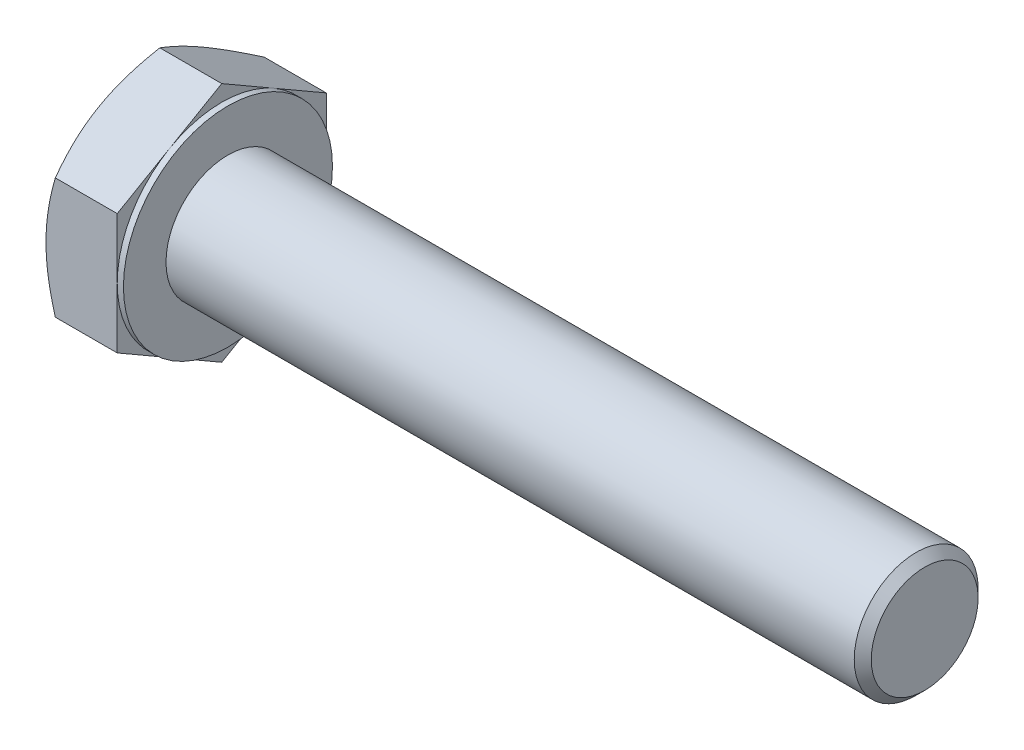
ISO-10303-21;
HEADER;
FILE_DESCRIPTION(('STEP AP214'),'2;1');
FILE_NAME('part.step','',(''),(''),'','','');
FILE_SCHEMA(('AUTOMOTIVE_DESIGN { 1 0 10303 214 1 1 1 1 }'));
ENDSEC;
DATA;
#1=APPLICATION_CONTEXT('core data for automotive mechanical design processes');
#2=APPLICATION_PROTOCOL_DEFINITION('international standard','automotive_design',2000,#1);
#3=PRODUCT_CONTEXT('',#1,'mechanical');
#4=PRODUCT('Part','Part','',(#3));
#5=PRODUCT_RELATED_PRODUCT_CATEGORY('part','',(#4));
#6=PRODUCT_DEFINITION_FORMATION('','',#4);
#7=PRODUCT_DEFINITION_CONTEXT('part definition',#1,'design');
#8=PRODUCT_DEFINITION('design','',#6,#7);
#9=PRODUCT_DEFINITION_SHAPE('','',#8);
#10=(LENGTH_UNIT() NAMED_UNIT(*) SI_UNIT(.MILLI.,.METRE.));
#11=(NAMED_UNIT(*) PLANE_ANGLE_UNIT() SI_UNIT($,.RADIAN.));
#12=(NAMED_UNIT(*) SI_UNIT($,.STERADIAN.) SOLID_ANGLE_UNIT());
#13=UNCERTAINTY_MEASURE_WITH_UNIT(LENGTH_MEASURE(1.E-05),#10,'distance_accuracy_value','');
#14=(GEOMETRIC_REPRESENTATION_CONTEXT(3) GLOBAL_UNCERTAINTY_ASSIGNED_CONTEXT((#13)) GLOBAL_UNIT_ASSIGNED_CONTEXT((#10,
#11,#12)) REPRESENTATION_CONTEXT('',''));
#15=CARTESIAN_POINT('',(0.,0.,0.));
#16=DIRECTION('',(0.,0.,1.));
#17=DIRECTION('',(1.,0.,0.));
#18=AXIS2_PLACEMENT_3D('',#15,#16,#17);
#19=CARTESIAN_POINT('',(10.,15.5884572681199,0.));
#20=DIRECTION('',(1.,0.,0.));
#21=DIRECTION('',(0.,0.,-1.));
#22=AXIS2_PLACEMENT_3D('',#19,#20,#21);
#23=PLANE('',#22);
#24=CARTESIAN_POINT('',(10.,0.,0.));
#25=DIRECTION('',(1.,0.,0.));
#26=DIRECTION('',(0.,0.,-1.));
#27=AXIS2_PLACEMENT_3D('',#24,#25,#26);
#28=CIRCLE('',#27,8.);
#29=CARTESIAN_POINT('',(10.,0.,-8.));
#30=VERTEX_POINT('',#29);
#31=EDGE_CURVE('E272',#30,#30,#28,.F.);
#32=ORIENTED_EDGE('',*,*,#31,.T.);
#33=EDGE_LOOP('',(#32));
#34=FACE_BOUND('',#33,.T.);
#35=CARTESIAN_POINT('',(10.,0.,0.));
#36=DIRECTION('',(1.,0.,0.));
#37=DIRECTION('',(0.,0.,-1.));
#38=AXIS2_PLACEMENT_3D('',#35,#36,#37);
#39=CIRCLE('',#38,13.5);
#40=CARTESIAN_POINT('',(10.,0.,-13.5));
#41=VERTEX_POINT('',#40);
#42=EDGE_CURVE('E291',#41,#41,#39,.T.);
#43=ORIENTED_EDGE('',*,*,#42,.T.);
#44=EDGE_LOOP('',(#43));
#45=FACE_BOUND('',#44,.T.);
#46=ADVANCED_FACE('F34',(#34,#45),#23,.T.);
#47=CARTESIAN_POINT('',(0.,0.,0.));
#48=DIRECTION('',(-1.,0.,0.));
#49=DIRECTION('',(0.,0.,1.));
#50=AXIS2_PLACEMENT_3D('',#47,#48,#49);
#51=CYLINDRICAL_SURFACE('',#50,8.);
#52=ORIENTED_EDGE('',*,*,#31,.F.);
#53=EDGE_LOOP('',(#52));
#54=FACE_BOUND('',#53,.T.);
#55=CARTESIAN_POINT('',(98.8985,0.,0.));
#56=DIRECTION('',(-1.,0.,0.));
#57=DIRECTION('',(0.,0.,1.));
#58=AXIS2_PLACEMENT_3D('',#55,#56,#57);
#59=CIRCLE('',#58,8.);
#60=CARTESIAN_POINT('',(98.8985,0.,8.));
#61=VERTEX_POINT('',#60);
#62=EDGE_CURVE('E269',#61,#61,#59,.T.);
#63=ORIENTED_EDGE('',*,*,#62,.T.);
#64=EDGE_LOOP('',(#63));
#65=FACE_BOUND('',#64,.T.);
#66=ADVANCED_FACE('F243',(#54,#65),#51,.T.);
#67=CARTESIAN_POINT('',(100.,0.,0.));
#68=DIRECTION('',(-1.,0.,0.));
#69=DIRECTION('',(0.,0.,1.));
#70=AXIS2_PLACEMENT_3D('',#67,#68,#69);
#71=CONICAL_SURFACE('',#70,6.8985,0.78539816339744);
#72=ORIENTED_EDGE('',*,*,#62,.F.);
#73=EDGE_LOOP('',(#72));
#74=FACE_BOUND('',#73,.T.);
#75=CARTESIAN_POINT('',(100.,0.,0.));
#76=DIRECTION('',(-1.,0.,0.));
#77=DIRECTION('',(0.,0.,1.));
#78=AXIS2_PLACEMENT_3D('',#75,#76,#77);
#79=CIRCLE('',#78,6.8985);
#80=CARTESIAN_POINT('',(100.,0.,6.8985));
#81=VERTEX_POINT('',#80);
#82=EDGE_CURVE('E267',#81,#81,#79,.T.);
#83=ORIENTED_EDGE('',*,*,#82,.T.);
#84=EDGE_LOOP('',(#83));
#85=FACE_BOUND('',#84,.T.);
#86=ADVANCED_FACE('F248',(#74,#85),#71,.T.);
#87=CARTESIAN_POINT('',(100.,0.,0.));
#88=DIRECTION('',(-1.,0.,0.));
#89=DIRECTION('',(0.,0.,1.));
#90=AXIS2_PLACEMENT_3D('',#87,#88,#89);
#91=PLANE('',#90);
#92=ORIENTED_EDGE('',*,*,#82,.F.);
#93=EDGE_LOOP('',(#92));
#94=FACE_BOUND('',#93,.T.);
#95=ADVANCED_FACE('F255',(#94),#91,.F.);
#96=CARTESIAN_POINT('',(9.2,13.5,0.));
#97=DIRECTION('',(1.,0.,0.));
#98=DIRECTION('',(0.,0.,-1.));
#99=AXIS2_PLACEMENT_3D('',#96,#97,#98);
#100=PLANE('',#99);
#101=DIRECTION('',(0.,0.500000000000001,0.866025403784438));
#102=VECTOR('',#101,1.);
#103=CARTESIAN_POINT('',(9.2,7.79422863405993,-13.5));
#104=LINE('',#103,#102);
#105=CARTESIAN_POINT('',(9.2,7.79422863405993,-13.5));
#106=VERTEX_POINT('',#105);
#107=CARTESIAN_POINT('',(9.2,11.6913429510899,-6.75000000000002));
#108=VERTEX_POINT('',#107);
#109=EDGE_CURVE('E167',#106,#108,#104,.T.);
#110=ORIENTED_EDGE('',*,*,#109,.T.);
#111=CARTESIAN_POINT('',(9.2,0.,0.));
#112=DIRECTION('',(-1.,0.,0.));
#113=DIRECTION('',(0.,0.,1.));
#114=AXIS2_PLACEMENT_3D('',#111,#112,#113);
#115=CIRCLE('',#114,13.5);
#116=CARTESIAN_POINT('',(9.2,0.,-13.5));
#117=VERTEX_POINT('',#116);
#118=EDGE_CURVE('E50',#108,#117,#115,.T.);
#119=ORIENTED_EDGE('',*,*,#118,.T.);
#120=DIRECTION('',(0.,1.,0.));
#121=VECTOR('',#120,1.);
#122=CARTESIAN_POINT('',(9.2,7.79422863405993,-13.5));
#123=LINE('',#122,#121);
#124=EDGE_CURVE('E39',#117,#106,#123,.T.);
#125=ORIENTED_EDGE('',*,*,#124,.T.);
#126=EDGE_LOOP('',(#110,#119,#125));
#127=FACE_BOUND('',#126,.T.);
#128=ADVANCED_FACE('F258',(#127),#100,.T.);
#129=CARTESIAN_POINT('',(9.2,15.5884572681199,0.));
#130=VERTEX_POINT('',#129);
#131=EDGE_CURVE('E165',#108,#130,#104,.T.);
#132=ORIENTED_EDGE('',*,*,#131,.T.);
#133=DIRECTION('',(0.,-0.500000000000001,0.866025403784438));
#134=VECTOR('',#133,1.);
#135=CARTESIAN_POINT('',(9.2,15.5884572681199,0.));
#136=LINE('',#135,#134);
#137=CARTESIAN_POINT('',(9.2,11.6913429510899,6.75000000000001));
#138=VERTEX_POINT('',#137);
#139=EDGE_CURVE('E164',#130,#138,#136,.T.);
#140=ORIENTED_EDGE('',*,*,#139,.T.);
#141=EDGE_CURVE('E153',#138,#108,#115,.T.);
#142=ORIENTED_EDGE('',*,*,#141,.T.);
#143=EDGE_LOOP('',(#132,#140,#142));
#144=FACE_BOUND('',#143,.T.);
#145=ADVANCED_FACE('F263',(#144),#100,.T.);
#146=CARTESIAN_POINT('',(9.2,7.79422863405994,13.5));
#147=VERTEX_POINT('',#146);
#148=EDGE_CURVE('E132',#138,#147,#136,.T.);
#149=ORIENTED_EDGE('',*,*,#148,.T.);
#150=DIRECTION('',(0.,-1.,0.));
#151=VECTOR('',#150,1.);
#152=CARTESIAN_POINT('',(9.2,7.79422863405994,13.5));
#153=LINE('',#152,#151);
#154=CARTESIAN_POINT('',(9.2,0.,13.5));
#155=VERTEX_POINT('',#154);
#156=EDGE_CURVE('E126',#147,#155,#153,.T.);
#157=ORIENTED_EDGE('',*,*,#156,.T.);
#158=EDGE_CURVE('E130',#155,#138,#115,.T.);
#159=ORIENTED_EDGE('',*,*,#158,.T.);
#160=EDGE_LOOP('',(#149,#157,#159));
#161=FACE_BOUND('',#160,.T.);
#162=ADVANCED_FACE('F128',(#161),#100,.T.);
#163=CARTESIAN_POINT('',(9.2,-7.79422863405994,13.5));
#164=VERTEX_POINT('',#163);
#165=EDGE_CURVE('E136',#155,#164,#153,.T.);
#166=ORIENTED_EDGE('',*,*,#165,.T.);
#167=DIRECTION('',(0.,-0.500000000000002,-0.866025403784438));
#168=VECTOR('',#167,1.);
#169=CARTESIAN_POINT('',(9.2,-15.5884572681199,0.));
#170=LINE('',#169,#168);
#171=CARTESIAN_POINT('',(9.2,-11.6913429510899,6.75000000000003));
#172=VERTEX_POINT('',#171);
#173=EDGE_CURVE('E143',#164,#172,#170,.T.);
#174=ORIENTED_EDGE('',*,*,#173,.T.);
#175=EDGE_CURVE('E140',#172,#155,#115,.T.);
#176=ORIENTED_EDGE('',*,*,#175,.T.);
#177=EDGE_LOOP('',(#166,#174,#176));
#178=FACE_BOUND('',#177,.T.);
#179=ADVANCED_FACE('F141',(#178),#100,.T.);
#180=CARTESIAN_POINT('',(9.2,-15.5884572681199,0.));
#181=VERTEX_POINT('',#180);
#182=EDGE_CURVE('E159',#172,#181,#170,.T.);
#183=ORIENTED_EDGE('',*,*,#182,.T.);
#184=DIRECTION('',(0.,0.500000000000001,-0.866025403784438));
#185=VECTOR('',#184,1.);
#186=CARTESIAN_POINT('',(9.2,-7.79422863405997,-13.5));
#187=LINE('',#186,#185);
#188=CARTESIAN_POINT('',(9.2,-11.6913429510899,-6.75000000000001));
#189=VERTEX_POINT('',#188);
#190=EDGE_CURVE('E327',#181,#189,#187,.T.);
#191=ORIENTED_EDGE('',*,*,#190,.T.);
#192=EDGE_CURVE('E147',#189,#172,#115,.T.);
#193=ORIENTED_EDGE('',*,*,#192,.T.);
#194=EDGE_LOOP('',(#183,#191,#193));
#195=FACE_BOUND('',#194,.T.);
#196=ADVANCED_FACE('F332',(#195),#100,.T.);
#197=CARTESIAN_POINT('',(9.2,-7.79422863405997,-13.5));
#198=VERTEX_POINT('',#197);
#199=EDGE_CURVE('E154',#189,#198,#187,.T.);
#200=ORIENTED_EDGE('',*,*,#199,.T.);
#201=EDGE_CURVE('E11',#198,#117,#123,.T.);
#202=ORIENTED_EDGE('',*,*,#201,.T.);
#203=EDGE_CURVE('E345',#117,#189,#115,.T.);
#204=ORIENTED_EDGE('',*,*,#203,.T.);
#205=EDGE_LOOP('',(#200,#202,#204));
#206=FACE_BOUND('',#205,.T.);
#207=ADVANCED_FACE('F264',(#206),#100,.T.);
#208=CARTESIAN_POINT('',(0.,0.,0.));
#209=DIRECTION('',(-1.,0.,0.));
#210=DIRECTION('',(0.,0.,1.));
#211=AXIS2_PLACEMENT_3D('',#208,#209,#210);
#212=CYLINDRICAL_SURFACE('',#211,13.5);
#213=ORIENTED_EDGE('',*,*,#118,.F.);
#214=ORIENTED_EDGE('',*,*,#141,.F.);
#215=ORIENTED_EDGE('',*,*,#158,.F.);
#216=ORIENTED_EDGE('',*,*,#175,.F.);
#217=ORIENTED_EDGE('',*,*,#192,.F.);
#218=ORIENTED_EDGE('',*,*,#203,.F.);
#219=EDGE_LOOP('',(#213,#214,#215,#216,#217,#218));
#220=FACE_BOUND('',#219,.T.);
#221=ORIENTED_EDGE('',*,*,#42,.F.);
#222=EDGE_LOOP('',(#221));
#223=FACE_BOUND('',#222,.T.);
#224=ADVANCED_FACE('F150',(#220,#223),#212,.T.);
#225=CARTESIAN_POINT('',(0.,15.5884572681199,0.));
#226=DIRECTION('',(1.,0.,0.));
#227=DIRECTION('',(0.,0.,-1.));
#228=AXIS2_PLACEMENT_3D('',#225,#226,#227);
#229=PLANE('',#228);
#230=CARTESIAN_POINT('',(0.,0.,0.));
#231=DIRECTION('',(1.,0.,0.));
#232=DIRECTION('',(0.,0.,-1.));
#233=AXIS2_PLACEMENT_3D('',#230,#231,#232);
#234=CIRCLE('',#233,13.5);
#235=CARTESIAN_POINT('',(0.,0.,-13.5));
#236=VERTEX_POINT('',#235);
#237=CARTESIAN_POINT('',(0.,11.6913429510899,-6.75000000000002));
#238=VERTEX_POINT('',#237);
#239=EDGE_CURVE('E290',#236,#238,#234,.T.);
#240=ORIENTED_EDGE('',*,*,#239,.F.);
#241=CARTESIAN_POINT('',(0.,-11.6913429510899,-6.75000000000001));
#242=VERTEX_POINT('',#241);
#243=EDGE_CURVE('E287',#242,#236,#234,.T.);
#244=ORIENTED_EDGE('',*,*,#243,.F.);
#245=CARTESIAN_POINT('',(0.,-11.6913429510899,6.75000000000002));
#246=VERTEX_POINT('',#245);
#247=EDGE_CURVE('E289',#246,#242,#234,.T.);
#248=ORIENTED_EDGE('',*,*,#247,.F.);
#249=CARTESIAN_POINT('',(0.,0.,13.5));
#250=VERTEX_POINT('',#249);
#251=EDGE_CURVE('E299',#250,#246,#234,.T.);
#252=ORIENTED_EDGE('',*,*,#251,.F.);
#253=CARTESIAN_POINT('',(0.,0.,0.));
#254=DIRECTION('',(-1.,0.,0.));
#255=DIRECTION('',(0.,0.,1.));
#256=AXIS2_PLACEMENT_3D('',#253,#254,#255);
#257=CIRCLE('',#256,13.5);
#258=CARTESIAN_POINT('',(0.,11.6913429510899,6.75000000000001));
#259=VERTEX_POINT('',#258);
#260=EDGE_CURVE('E168',#250,#259,#257,.T.);
#261=ORIENTED_EDGE('',*,*,#260,.T.);
#262=EDGE_CURVE('E294',#238,#259,#234,.T.);
#263=ORIENTED_EDGE('',*,*,#262,.F.);
#264=EDGE_LOOP('',(#240,#244,#248,#252,#261,#263));
#265=FACE_BOUND('',#264,.T.);
#266=ADVANCED_FACE('F197',(#265),#229,.F.);
#267=CARTESIAN_POINT('',(0.,0.,0.));
#268=DIRECTION('',(1.,0.,0.));
#269=DIRECTION('',(0.,0.,-1.));
#270=AXIS2_PLACEMENT_3D('',#267,#268,#269);
#271=CONICAL_SURFACE('',#270,13.5,1.0471975511966);
#272=CARTESIAN_POINT('',(1.20583803334744,7.7941131640061,13.5002));
#273=CARTESIAN_POINT('',(1.10693600185288,7.96542734310489,13.2034751377439));
#274=CARTESIAN_POINT('',(1.01252193890574,8.13740973961965,12.9055928889729));
#275=CARTESIAN_POINT('',(0.833917254878249,8.48275363037183,12.3074397241066));
#276=CARTESIAN_POINT('',(0.749729996263837,8.65611555833004,12.0071680567849));
#277=CARTESIAN_POINT('',(0.592710566835617,9.00455355753,11.403655738883));
#278=CARTESIAN_POINT('',(0.51990526259524,9.17963267786846,11.1004098071123));
#279=CARTESIAN_POINT('',(0.387213084407287,9.53100751002426,10.4918107453174));
#280=CARTESIAN_POINT('',(0.327325473477572,9.7073031518439,10.1864577365329));
#281=CARTESIAN_POINT('',(0.223015910639062,10.0565936504728,9.58146884630662));
#282=CARTESIAN_POINT('',(0.17824871362455,10.2295625754616,9.28187788009544));
#283=CARTESIAN_POINT('',(0.103183935683262,10.5762930076628,8.68132315499258));
#284=CARTESIAN_POINT('',(0.0728866332670118,10.7500545300658,8.38035936979001));
#285=CARTESIAN_POINT('',(0.0275266341970793,11.0978694745929,7.77792621423743));
#286=CARTESIAN_POINT('',(0.0124458340286923,11.2719223024903,7.47645787311809));
#287=CARTESIAN_POINT('',(-0.00215683633239847,11.6201886315474,6.87324289662571));
#288=CARTESIAN_POINT('',(-0.00167918727246797,11.7944021275762,6.57149627013964));
#289=CARTESIAN_POINT('',(0.0137483336445674,12.1200937136619,6.00738189544142));
#290=CARTESIAN_POINT('',(0.0268164189930316,12.271595012447,5.74497394853304));
#291=CARTESIAN_POINT('',(0.0644725699586012,12.5742491226741,5.22076165250011));
#292=CARTESIAN_POINT('',(0.0890614504269867,12.7254019087062,4.95895734738682));
#293=CARTESIAN_POINT('',(0.149330465436024,13.0272768920407,4.43609453871756));
#294=CARTESIAN_POINT('',(0.185019760507138,13.1779986295677,4.17503683151571));
#295=CARTESIAN_POINT('',(0.266863438712335,13.4787354904687,3.65414530872634));
#296=CARTESIAN_POINT('',(0.313018533291661,13.6287505650972,3.39431157756869));
#297=CARTESIAN_POINT('',(0.468349259272658,14.0841296870377,2.60557180166152));
#298=CARTESIAN_POINT('',(0.59301303342539,14.3881750256073,2.07894982745447));
#299=CARTESIAN_POINT('',(0.875948867571987,14.9917319951217,1.03355849099334));
#300=CARTESIAN_POINT('',(1.0341544783732,15.2912513537195,0.514775744051519));
#301=CARTESIAN_POINT('',(1.20583803334745,15.5885727381737,-0.000199999999998265));
#302=B_SPLINE_CURVE_WITH_KNOTS('',3,(#272,#273,#274,#275,#276,#277,#278,#279,#280,#281,#282,
#283,#284,#285,#286,#287,#288,#289,#290,#291,#292,#293,#294,#295,#296,#297,#298,#299,#300,#301),
.UNSPECIFIED.,.F.,.F.,(4,2,2,2,2,2,2,2,2,2,2,2,2,2,4),(0.,1.0698794936454,2.14010980578041,
3.21282939735429,4.28548777177525,5.33167033690336,6.37787303770781,7.42282956789443,
8.46775380954026,9.37738732544599,10.2870851882952,11.1975357730373,12.1080482670512,
13.9691139233208,15.8265265395635),.UNSPECIFIED.);
#303=CARTESIAN_POINT('',(1.20577136594005,15.5884572681199,0.));
#304=VERTEX_POINT('',#303);
#305=EDGE_CURVE('E215',#259,#304,#302,.T.);
#306=ORIENTED_EDGE('',*,*,#305,.T.);
#307=CARTESIAN_POINT('',(1.20583803334745,15.5885727381737,0.0002));
#308=CARTESIAN_POINT('',(1.10693600185289,15.417258559075,-0.296524862256054));
#309=CARTESIAN_POINT('',(1.01252193890575,15.2452761625602,-0.594407111027072));
#310=CARTESIAN_POINT('',(0.833917254878256,14.899932271808,-1.19256027589336));
#311=CARTESIAN_POINT('',(0.749729996263842,14.7265703438498,-1.49283194321508));
#312=CARTESIAN_POINT('',(0.592710566835621,14.3781323446498,-2.09634426111705));
#313=CARTESIAN_POINT('',(0.519905262595244,14.2030532243114,-2.39959019288773));
#314=CARTESIAN_POINT('',(0.38721308440729,13.8516783921556,-3.00818925468256));
#315=CARTESIAN_POINT('',(0.327325473477575,13.6753827503359,-3.31354226346714));
#316=CARTESIAN_POINT('',(0.223015910639064,13.3260922517071,-3.91853115369338));
#317=CARTESIAN_POINT('',(0.178248713624552,13.1531233267183,-4.21812211990455));
#318=CARTESIAN_POINT('',(0.103183935683263,12.8063928945171,-4.81867684500741));
#319=CARTESIAN_POINT('',(0.0728866332670115,12.632631372114,-5.11964063020999));
#320=CARTESIAN_POINT('',(0.0275266341970785,12.284816427587,-5.72207378576257));
#321=CARTESIAN_POINT('',(0.0124458340286916,12.1107635996896,-6.02354212688191));
#322=CARTESIAN_POINT('',(-0.00215683633240033,11.7624972706325,-6.62675710337429));
#323=CARTESIAN_POINT('',(-0.00167918727247124,11.5882837746037,-6.92850372986036));
#324=CARTESIAN_POINT('',(0.0137483336445631,11.2625921885179,-7.49261810455858));
#325=CARTESIAN_POINT('',(0.0268164189930275,11.1110908897329,-7.75502605146696));
#326=CARTESIAN_POINT('',(0.0644725699585969,10.8084367795058,-8.27923834749989));
#327=CARTESIAN_POINT('',(0.0890614504269819,10.6572839934736,-8.54104265261318));
#328=CARTESIAN_POINT('',(0.149330465436018,10.3554090101392,-9.06390546128244));
#329=CARTESIAN_POINT('',(0.185019760507132,10.2046872726121,-9.32496316848429));
#330=CARTESIAN_POINT('',(0.266863438712328,9.9039504117111,-9.84585469127366));
#331=CARTESIAN_POINT('',(0.313018533291655,9.75393533708269,-10.1056884224313));
#332=CARTESIAN_POINT('',(0.468349259272652,9.29855621514212,-10.8944281983385));
#333=CARTESIAN_POINT('',(0.593013033425382,8.9945108765725,-11.4210501725455));
#334=CARTESIAN_POINT('',(0.875948867571977,8.39095390705816,-12.4664415090067));
#335=CARTESIAN_POINT('',(1.03415447837319,8.09143454846036,-12.9852242559485));
#336=CARTESIAN_POINT('',(1.20583803334744,7.79411316400609,-13.5002));
#337=B_SPLINE_CURVE_WITH_KNOTS('',3,(#307,#308,#309,#310,#311,#312,#313,#314,#315,#316,#317,
#318,#319,#320,#321,#322,#323,#324,#325,#326,#327,#328,#329,#330,#331,#332,#333,#334,#335,#336),
.UNSPECIFIED.,.F.,.F.,(4,2,2,2,2,2,2,2,2,2,2,2,2,2,4),(0.,1.0698794936454,2.14010980578041,
3.21282939735429,4.28548777177525,5.33167033690336,6.37787303770781,7.42282956789444,
8.46775380954027,9.377387325446,10.2870851882952,11.1975357730374,12.1080482670513,
13.9691139233208,15.8265265395635),.UNSPECIFIED.);
#338=EDGE_CURVE('E58',#304,#238,#337,.T.);
#339=ORIENTED_EDGE('',*,*,#338,.T.);
#340=ORIENTED_EDGE('',*,*,#262,.T.);
#341=EDGE_LOOP('',(#306,#339,#340));
#342=FACE_BOUND('',#341,.T.);
#343=ADVANCED_FACE('F341',(#342),#271,.T.);
#344=CARTESIAN_POINT('',(6.65552250495166,-21.0745325912131,13.5));
#345=CARTESIAN_POINT('',(6.5119213196538,-20.7791464058322,13.5));
#346=CARTESIAN_POINT('',(6.3690258053421,-20.4834173215818,13.5));
#347=CARTESIAN_POINT('',(6.08480566588022,-19.891201849661,13.5));
#348=CARTESIAN_POINT('',(5.9434810561073,-19.5947154546124,13.5));
#349=CARTESIAN_POINT('',(5.52206654710979,-18.7039359898516,13.5));
#350=CARTESIAN_POINT('',(5.24457752621021,-18.1084078939184,13.5));
#351=CARTESIAN_POINT('',(4.69672238464205,-16.9102372700575,13.5));
#352=CARTESIAN_POINT('',(4.42640208158634,-16.3075737428368,13.5));
#353=CARTESIAN_POINT('',(3.89663579850197,-15.0975022908283,13.5));
#354=CARTESIAN_POINT('',(3.63718931395402,-14.4900945877136,13.5));
#355=CARTESIAN_POINT('',(3.12369893947335,-13.2494069073504,13.5));
#356=CARTESIAN_POINT('',(2.8701164550237,-12.6159349800556,13.5));
#357=CARTESIAN_POINT('',(2.38180982352807,-11.3416266475287,13.5));
#358=CARTESIAN_POINT('',(2.14708777368623,-10.7007894323374,13.5));
#359=CARTESIAN_POINT('',(1.70256667973608,-9.41190712282995,13.5));
#360=CARTESIAN_POINT('',(1.49271834821402,-8.76387916273799,13.5));
#361=CARTESIAN_POINT('',(1.10457449552645,-7.45846720315997,13.5));
#362=CARTESIAN_POINT('',(0.926269180857156,-6.80108617635228,13.5));
#363=CARTESIAN_POINT('',(0.689343391492074,-5.80970729773043,13.5));
#364=CARTESIAN_POINT('',(0.615621316462391,-5.47929754824038,13.5));
#365=CARTESIAN_POINT('',(0.479218121726768,-4.81619500784243,13.5));
#366=CARTESIAN_POINT('',(0.416536782037618,-4.48350226255976,13.5));
#367=CARTESIAN_POINT('',(0.303312809434867,-3.81605303016929,13.5));
#368=CARTESIAN_POINT('',(0.252769967446792,-3.48129657870881,13.5));
#369=CARTESIAN_POINT('',(0.164825873705821,-2.8100632435211,13.5));
#370=CARTESIAN_POINT('',(0.127424101516909,-2.47358642846234,13.5));
#371=CARTESIAN_POINT('',(0.0669819137111105,-1.80383571610776,13.5));
#372=CARTESIAN_POINT('',(0.0437576325332615,-1.47057851441347,13.5));
#373=CARTESIAN_POINT('',(0.0114301437540811,-0.803380769868857,13.5));
#374=CARTESIAN_POINT('',(0.00232669798564708,-0.469440238638946,13.5));
#375=CARTESIAN_POINT('',(-0.00154201275903892,0.198526894640142,13.5));
#376=CARTESIAN_POINT('',(0.00369274805279489,0.532553496843042,13.5));
#377=CARTESIAN_POINT('',(0.0283710664469002,1.2000851507397,13.5));
#378=CARTESIAN_POINT('',(0.0478152523229275,1.53359017871768,13.5));
#379=CARTESIAN_POINT('',(0.110874417403469,2.33095876873586,13.5));
#380=CARTESIAN_POINT('',(0.161000567994547,2.79431674635738,13.5));
#381=CARTESIAN_POINT('',(0.285984098802108,3.71768710859737,13.5));
#382=CARTESIAN_POINT('',(0.360844727080062,4.17769904571074,13.5));
#383=CARTESIAN_POINT('',(0.53263439097848,5.093907146853,13.5));
#384=CARTESIAN_POINT('',(0.62958022331539,5.55010013120955,13.5));
#385=CARTESIAN_POINT('',(0.842574156780341,6.45795589096169,13.5));
#386=CARTESIAN_POINT('',(0.958622001211247,6.90961872714792,13.5));
#387=CARTESIAN_POINT('',(1.20975308172247,7.81842814998754,13.5));
#388=CARTESIAN_POINT('',(1.34520276420359,8.27547276919521,13.5));
#389=CARTESIAN_POINT('',(1.63037567165068,9.18506172599708,13.5));
#390=CARTESIAN_POINT('',(1.78009899260467,9.63760603330478,13.5));
#391=CARTESIAN_POINT('',(2.09141761032544,10.5384131278266,13.5));
#392=CARTESIAN_POINT('',(2.25300914829631,10.986677220241,13.5));
#393=CARTESIAN_POINT('',(2.58613586655752,11.8794725453459,13.5));
#394=CARTESIAN_POINT('',(2.75767091863969,12.3240038260815,13.5));
#395=CARTESIAN_POINT('',(3.18025624760456,13.3892782836475,13.5));
#396=CARTESIAN_POINT('',(3.43535483887552,14.0084132883588,13.5));
#397=CARTESIAN_POINT('',(3.95837880975389,15.2412584701716,13.5));
#398=CARTESIAN_POINT('',(4.22630505867306,15.8549682762671,13.5));
#399=CARTESIAN_POINT('',(4.77236357831712,17.0779981981639,13.5));
#400=CARTESIAN_POINT('',(5.05049833311979,17.6873172017998,13.5));
#401=CARTESIAN_POINT('',(5.6148702751147,18.9021637926335,13.5));
#402=CARTESIAN_POINT('',(5.90110727081901,19.5076914690229,13.5));
#403=CARTESIAN_POINT('',(6.48047787553089,20.7163040814209,13.5));
#404=CARTESIAN_POINT('',(6.77361916133141,21.3193853307735,13.5));
#405=CARTESIAN_POINT('',(7.36527607850463,22.5229054555965,13.5));
#406=CARTESIAN_POINT('',(7.66379173547757,23.1233443184633,13.5));
#407=CARTESIAN_POINT('',(8.26521723033142,24.3219086940862,13.5));
#408=CARTESIAN_POINT('',(8.56812644134661,24.9200345217343,13.5));
#409=CARTESIAN_POINT('',(9.17764891450146,26.1143969327798,13.5));
#410=CARTESIAN_POINT('',(9.48426219155985,26.7106335085557,13.5));
#411=CARTESIAN_POINT('',(10.3554001639816,28.3938429255261,13.5));
#412=CARTESIAN_POINT('',(10.9235502093501,29.4789393963536,13.5));
#413=CARTESIAN_POINT('',(12.0675588478843,31.6451050831007,13.5));
#414=CARTESIAN_POINT('',(12.6434177389315,32.7261741413195,13.5));
#415=CARTESIAN_POINT('',(13.7994904405044,34.8823093902718,13.5));
#416=CARTESIAN_POINT('',(14.3796887590139,35.9573838932129,13.5));
#417=CARTESIAN_POINT('',(15.2533946206875,37.5681041358021,13.5));
#418=CARTESIAN_POINT('',(15.5451895383682,38.1046802403169,13.5));
#419=CARTESIAN_POINT('',(16.129801129039,39.1772745244478,13.5));
#420=CARTESIAN_POINT('',(16.4226178004543,39.7132927049222,13.5));
#421=CARTESIAN_POINT('',(16.71588588851,40.2490638615173,13.5));
#422=B_SPLINE_CURVE_WITH_KNOTS('',3,(#344,#345,#346,#347,#348,#349,#350,#351,#352,#353,#354,
#355,#356,#357,#358,#359,#360,#361,#362,#363,#364,#365,#366,#367,#368,#369,#370,#371,#372,#373,
#374,#375,#376,#377,#378,#379,#380,#381,#382,#383,#384,#385,#386,#387,#388,#389,#390,#391,#392,
#393,#394,#395,#396,#397,#398,#399,#400,#401,#402,#403,#404,#405,#406,#407,#408,#409,#410,#411,
#412,#413,#414,#415,#416,#417,#418,#419,#420,#421),.UNSPECIFIED.,.F.,.F.,(4,2,2,2,2,2,2,2,2,2,2,
2,2,2,2,2,2,2,2,2,2,2,2,2,2,2,2,2,2,2,2,2,2,2,2,2,2,2,4),(0.,0.98532495112201,1.97065953889851,
3.94161322800506,5.92306611644916,7.90442696819132,9.95122396090017,11.9982482351106,
14.0411459982621,16.0834083632248,17.0988569842376,18.1142853704641,19.1296962656147,
20.1450669421231,21.1469730260158,22.1488622112154,23.1507531983712,24.1526884885118,
25.550102612193,26.947700313315,28.3463645153709,29.7450099233969,31.1748114857401,
32.6046226639565,34.0339829417775,35.463324794027,37.4720142115936,39.4808399483455,
41.4901577845392,43.4994281722061,45.5110492723814,47.5226799572338,49.5340263951321,
51.5453809367633,55.2198486699729,58.8944588024731,62.5593771469718,64.391731018899,
66.2240820679583),.UNSPECIFIED.);
#423=CARTESIAN_POINT('',(1.20577136594004,7.79422863405994,13.5));
#424=VERTEX_POINT('',#423);
#425=EDGE_CURVE('E227',#250,#424,#422,.T.);
#426=ORIENTED_EDGE('',*,*,#425,.T.);
#427=EDGE_CURVE('E226',#424,#259,#302,.T.);
#428=ORIENTED_EDGE('',*,*,#427,.T.);
#429=ORIENTED_EDGE('',*,*,#260,.F.);
#430=EDGE_LOOP('',(#426,#428,#429));
#431=FACE_BOUND('',#430,.T.);
#432=ADVANCED_FACE('F337',(#431),#271,.T.);
#433=CARTESIAN_POINT('',(1.20577136594004,-7.79422863405994,13.5));
#434=VERTEX_POINT('',#433);
#435=EDGE_CURVE('E270',#434,#250,#422,.T.);
#436=ORIENTED_EDGE('',*,*,#435,.T.);
#437=ORIENTED_EDGE('',*,*,#251,.T.);
#438=CARTESIAN_POINT('',(1.20583803334746,-15.5885727381738,-0.000200000000000067));
#439=CARTESIAN_POINT('',(1.1069360018529,-15.417258559075,0.296524862256054));
#440=CARTESIAN_POINT('',(1.01252193890576,-15.2452761625602,0.594407111027073));
#441=CARTESIAN_POINT('',(0.833917254878267,-14.899932271808,1.19256027589336));
#442=CARTESIAN_POINT('',(0.749729996263854,-14.7265703438498,1.49283194321508));
#443=CARTESIAN_POINT('',(0.592710566835633,-14.3781323446499,2.09634426111705));
#444=CARTESIAN_POINT('',(0.519905262595255,-14.2030532243114,2.39959019288773));
#445=CARTESIAN_POINT('',(0.3872130844073,-13.8516783921556,3.00818925468256));
#446=CARTESIAN_POINT('',(0.327325473477584,-13.675382750336,3.31354226346714));
#447=CARTESIAN_POINT('',(0.223015910639073,-13.3260922517071,3.91853115369338));
#448=CARTESIAN_POINT('',(0.178248713624561,-13.1531233267183,4.21812211990456));
#449=CARTESIAN_POINT('',(0.103183935683272,-12.8063928945171,4.81867684500742));
#450=CARTESIAN_POINT('',(0.0728866332670203,-12.632631372114,5.11964063021));
#451=CARTESIAN_POINT('',(0.0275266341970863,-12.284816427587,5.72207378576257));
#452=CARTESIAN_POINT('',(0.0124458340286988,-12.1107635996896,6.02354212688192));
#453=CARTESIAN_POINT('',(-0.00215683633239394,-11.7624972706325,6.62675710337429));
#454=CARTESIAN_POINT('',(-0.0016791872724649,-11.5882837746037,6.92850372986036));
#455=CARTESIAN_POINT('',(0.0137483336445693,-11.2625921885179,7.49261810455858));
#456=CARTESIAN_POINT('',(0.0268164189930336,-11.1110908897329,7.75502605146696));
#457=CARTESIAN_POINT('',(0.0644725699586028,-10.8084367795058,8.27923834749989));
#458=CARTESIAN_POINT('',(0.0890614504269877,-10.6572839934736,8.54104265261319));
#459=CARTESIAN_POINT('',(0.149330465436024,-10.3554090101392,9.06390546128244));
#460=CARTESIAN_POINT('',(0.185019760507138,-10.2046872726121,9.32496316848429));
#461=CARTESIAN_POINT('',(0.266863438712334,-9.90395041171111,9.84585469127366));
#462=CARTESIAN_POINT('',(0.31301853329166,-9.75393533708269,10.1056884224313));
#463=CARTESIAN_POINT('',(0.468349259272654,-9.29855621514212,10.8944281983385));
#464=CARTESIAN_POINT('',(0.593013033425385,-8.9945108765725,11.4210501725455));
#465=CARTESIAN_POINT('',(0.875948867571981,-8.39095390705817,12.4664415090067));
#466=CARTESIAN_POINT('',(1.0341544783732,-8.09143454846037,12.9852242559485));
#467=CARTESIAN_POINT('',(1.20583803334744,-7.7941131640061,13.5002));
#468=B_SPLINE_CURVE_WITH_KNOTS('',3,(#438,#439,#440,#441,#442,#443,#444,#445,#446,#447,#448,
#449,#450,#451,#452,#453,#454,#455,#456,#457,#458,#459,#460,#461,#462,#463,#464,#465,#466,#467),
.UNSPECIFIED.,.F.,.F.,(4,2,2,2,2,2,2,2,2,2,2,2,2,2,4),(0.,1.06987949364541,2.14010980578041,
3.21282939735429,4.28548777177526,5.33167033690337,6.37787303770782,7.42282956789445,
8.46775380954028,9.377387325446,10.2870851882952,11.1975357730374,12.1080482670513,
13.9691139233208,15.8265265395635),.UNSPECIFIED.);
#469=EDGE_CURVE('E217',#246,#434,#468,.T.);
#470=ORIENTED_EDGE('',*,*,#469,.T.);
#471=EDGE_LOOP('',(#436,#437,#470));
#472=FACE_BOUND('',#471,.T.);
#473=ADVANCED_FACE('F186',(#472),#271,.T.);
#474=CARTESIAN_POINT('',(1.20577136594006,-15.5884572681199,0.));
#475=VERTEX_POINT('',#474);
#476=EDGE_CURVE('E210',#475,#246,#468,.T.);
#477=ORIENTED_EDGE('',*,*,#476,.T.);
#478=ORIENTED_EDGE('',*,*,#247,.T.);
#479=CARTESIAN_POINT('',(1.20583803334745,-7.79411316400613,-13.5002));
#480=CARTESIAN_POINT('',(1.10693600185289,-7.96542734310492,-13.2034751377439));
#481=CARTESIAN_POINT('',(1.01252193890575,-8.13740973961967,-12.9055928889729));
#482=CARTESIAN_POINT('',(0.833917254878257,-8.48275363037185,-12.3074397241066));
#483=CARTESIAN_POINT('',(0.749729996263844,-8.65611555833007,-12.0071680567849));
#484=CARTESIAN_POINT('',(0.592710566835625,-9.00455355753002,-11.4036557388829));
#485=CARTESIAN_POINT('',(0.519905262595249,-9.17963267786848,-11.1004098071123));
#486=CARTESIAN_POINT('',(0.387213084407295,-9.53100751002428,-10.4918107453174));
#487=CARTESIAN_POINT('',(0.327325473477581,-9.70730315184392,-10.1864577365329));
#488=CARTESIAN_POINT('',(0.223015910639072,-10.0565936504728,-9.58146884630662));
#489=CARTESIAN_POINT('',(0.178248713624561,-10.2295625754616,-9.28187788009544));
#490=CARTESIAN_POINT('',(0.103183935683273,-10.5762930076628,-8.68132315499258));
#491=CARTESIAN_POINT('',(0.0728866332670213,-10.7500545300659,-8.38035936979));
#492=CARTESIAN_POINT('',(0.0275266341970889,-11.0978694745929,-7.77792621423743));
#493=CARTESIAN_POINT('',(0.0124458340287029,-11.2719223024903,-7.47645787311808));
#494=CARTESIAN_POINT('',(-0.00215683633238712,-11.6201886315474,-6.87324289662571));
#495=CARTESIAN_POINT('',(-0.00167918727245706,-11.7944021275762,-6.57149627013964));
#496=CARTESIAN_POINT('',(0.0137483336445784,-12.1200937136619,-6.00738189544142));
#497=CARTESIAN_POINT('',(0.026816418993043,-12.271595012447,-5.74497394853304));
#498=CARTESIAN_POINT('',(0.0644725699586134,-12.5742491226741,-5.22076165250011));
#499=CARTESIAN_POINT('',(0.0890614504269993,-12.7254019087063,-4.95895734738681));
#500=CARTESIAN_POINT('',(0.149330465436037,-13.0272768920407,-4.43609453871756));
#501=CARTESIAN_POINT('',(0.185019760507151,-13.1779986295677,-4.17503683151571));
#502=CARTESIAN_POINT('',(0.266863438712347,-13.4787354904688,-3.65414530872634));
#503=CARTESIAN_POINT('',(0.313018533291674,-13.6287505650972,-3.39431157756869));
#504=CARTESIAN_POINT('',(0.46834925927267,-14.0841296870377,-2.60557180166152));
#505=CARTESIAN_POINT('',(0.593013033425402,-14.3881750256074,-2.07894982745446));
#506=CARTESIAN_POINT('',(0.875948867572,-14.9917319951217,-1.03355849099333));
#507=CARTESIAN_POINT('',(1.03415447837322,-15.2912513537195,-0.514775744051516));
#508=CARTESIAN_POINT('',(1.20583803334746,-15.5885727381738,0.000199999999999342));
#509=B_SPLINE_CURVE_WITH_KNOTS('',3,(#479,#480,#481,#482,#483,#484,#485,#486,#487,#488,#489,
#490,#491,#492,#493,#494,#495,#496,#497,#498,#499,#500,#501,#502,#503,#504,#505,#506,#507,#508),
.UNSPECIFIED.,.F.,.F.,(4,2,2,2,2,2,2,2,2,2,2,2,2,2,4),(0.,1.0698794936454,2.14010980578041,
3.21282939735429,4.28548777177525,5.33167033690336,6.37787303770781,7.42282956789444,
8.46775380954027,9.37738732544599,10.2870851882952,11.1975357730374,12.1080482670513,
13.9691139233208,15.8265265395635),.UNSPECIFIED.);
#510=EDGE_CURVE('E216',#242,#475,#509,.T.);
#511=ORIENTED_EDGE('',*,*,#510,.T.);
#512=EDGE_LOOP('',(#477,#478,#511));
#513=FACE_BOUND('',#512,.T.);
#514=ADVANCED_FACE('F308',(#513),#271,.T.);
#515=CARTESIAN_POINT('',(1.20577136594004,7.79422863405993,-13.5));
#516=VERTEX_POINT('',#515);
#517=EDGE_CURVE('E218',#238,#516,#337,.T.);
#518=ORIENTED_EDGE('',*,*,#517,.T.);
#519=CARTESIAN_POINT('',(6.65552250367822,-21.0745325885938,-13.5));
#520=CARTESIAN_POINT('',(6.51192131840696,-20.7791464032569,-13.5));
#521=CARTESIAN_POINT('',(6.36902580412184,-20.4834173190504,-13.5));
#522=CARTESIAN_POINT('',(6.08480566471307,-19.8912018472178,-13.5));
#523=CARTESIAN_POINT('',(5.94348105496668,-19.5947154522132,-13.5));
#524=CARTESIAN_POINT('',(5.5220665460487,-18.7039359875849,-13.5));
#525=CARTESIAN_POINT('',(5.244577525202,-18.10840789174,-13.5));
#526=CARTESIAN_POINT('',(4.69672238373966,-16.9102372680572,-13.5));
#527=CARTESIAN_POINT('',(4.42640208073687,-16.3075737409263,-13.5));
#528=CARTESIAN_POINT('',(3.89663579775745,-15.0975022890979,-13.5));
#529=CARTESIAN_POINT('',(3.63718931326154,-14.4900945860736,-13.5));
#530=CARTESIAN_POINT('',(3.12369893888642,-13.2494069058981,-13.5));
#531=CARTESIAN_POINT('',(2.87011645449016,-12.6159349787007,-13.5));
#532=CARTESIAN_POINT('',(2.38180982309845,-11.3416266463701,-13.5));
#533=CARTESIAN_POINT('',(2.14708777330713,-10.7007894312778,-13.5));
#534=CARTESIAN_POINT('',(1.70256667945316,-9.41190712197011,-13.5));
#535=CARTESIAN_POINT('',(1.49271834797678,-8.76387916197896,-13.5));
#536=CARTESIAN_POINT('',(1.10457449537307,-7.45846720260531,-13.5));
#537=CARTESIAN_POINT('',(0.926269180741969,-6.8010861759012,-13.5));
#538=CARTESIAN_POINT('',(0.689343391431633,-5.80970729746216,-13.5));
#539=CARTESIAN_POINT('',(0.615621316422012,-5.47929754805035,-13.5));
#540=CARTESIAN_POINT('',(0.479218121721373,-4.81619500780996,-13.5));
#541=CARTESIAN_POINT('',(0.416536782047146,-4.48350226260662,-13.5));
#542=CARTESIAN_POINT('',(0.3033128094683,-3.81605303037569,-13.5));
#543=CARTESIAN_POINT('',(0.252769967489211,-3.48129657899541,-13.5));
#544=CARTESIAN_POINT('',(0.164825873759607,-2.81006324396878,-13.5));
#545=CARTESIAN_POINT('',(0.127424101573077,-2.47358642899089,-13.5));
#546=CARTESIAN_POINT('',(0.0669819137648989,-1.80383571679638,-13.5));
#547=CARTESIAN_POINT('',(0.0437576325824183,-1.47057851518126,-13.5));
#548=CARTESIAN_POINT('',(0.0114301437869927,-0.803380770794844,-13.5));
#549=CARTESIAN_POINT('',(0.00232669800694515,-0.469440239643945,-13.5));
#550=CARTESIAN_POINT('',(-0.00154201276778081,0.198526893477715,-13.5));
#551=CARTESIAN_POINT('',(0.00369274802562516,0.5325534956022,-13.5));
#552=CARTESIAN_POINT('',(0.028371066376554,1.20008514934305,-13.5));
#553=CARTESIAN_POINT('',(0.0478152522278321,1.53359017724365,-13.5));
#554=CARTESIAN_POINT('',(0.110874417247485,2.33095876714181,-13.5));
#555=CARTESIAN_POINT('',(0.161000567803473,2.79431674472104,-13.5));
#556=CARTESIAN_POINT('',(0.285984098538982,3.71768710687835,-13.5));
#557=CARTESIAN_POINT('',(0.360844726779974,4.17769904395133,-13.5));
#558=CARTESIAN_POINT('',(0.532634390603886,5.0939071450143,-13.5));
#559=CARTESIAN_POINT('',(0.629580222903247,5.55010012933193,-13.5));
#560=CARTESIAN_POINT('',(0.842574156293457,6.45795588900738,-13.5));
#561=CARTESIAN_POINT('',(0.958622000687172,6.90961872515582,-13.5));
#562=CARTESIAN_POINT('',(1.20975308112384,7.81842814791886,-13.5));
#563=CARTESIAN_POINT('',(1.34520276356758,8.27547276708776,-13.5));
#564=CARTESIAN_POINT('',(1.63037567094106,9.1850617238125,-13.5));
#565=CARTESIAN_POINT('',(1.78009899185882,9.63760603108184,-13.5));
#566=CARTESIAN_POINT('',(2.09141760950839,10.5384131255273,-13.5));
#567=CARTESIAN_POINT('',(2.2530091474443,10.9866772179035,-13.5));
#568=CARTESIAN_POINT('',(2.58613586563679,11.8794725429323,-13.5));
#569=CARTESIAN_POINT('',(2.75767091768519,12.3240038236297,-13.5));
#570=CARTESIAN_POINT('',(3.18025624659638,13.3892782811702,-13.5));
#571=CARTESIAN_POINT('',(3.4353548378497,14.0084132858931,-13.5));
#572=CARTESIAN_POINT('',(3.95837880869703,15.241258467728,-13.5));
#573=CARTESIAN_POINT('',(4.22630505760281,15.8549682738339,-13.5));
#574=CARTESIAN_POINT('',(4.77236357722331,17.0779981957502,-13.5));
#575=CARTESIAN_POINT('',(5.05049833201583,17.6873171993954,-13.5));
#576=CARTESIAN_POINT('',(5.61487027399285,18.9021637902467,-13.5));
#577=CARTESIAN_POINT('',(5.90110726968943,19.5076914666444,-13.5));
#578=CARTESIAN_POINT('',(6.48047787438787,20.7163040790586,-13.5));
#579=CARTESIAN_POINT('',(6.77361916018269,21.3193853284191,-13.5));
#580=CARTESIAN_POINT('',(7.36527607734597,22.5229054532574,-13.5));
#581=CARTESIAN_POINT('',(7.66379173431467,23.1233443161314,-13.5));
#582=CARTESIAN_POINT('',(8.26521722916112,24.3219086917683,-13.5));
#583=CARTESIAN_POINT('',(8.56812644017317,24.9200345194231,-13.5));
#584=CARTESIAN_POINT('',(9.17764891332262,26.1143969304816,-13.5));
#585=CARTESIAN_POINT('',(9.48426219037876,26.7106335062638,-13.5));
#586=CARTESIAN_POINT('',(10.3554001627905,28.3938429232427,-13.5));
#587=CARTESIAN_POINT('',(10.9235502081522,29.478939394072,-13.5));
#588=CARTESIAN_POINT('',(12.067558846674,31.645105080822,-13.5));
#589=CARTESIAN_POINT('',(12.6434177377157,32.726174139042,-13.5));
#590=CARTESIAN_POINT('',(13.7994904392779,34.8823093879943,-13.5));
#591=CARTESIAN_POINT('',(14.3796887577822,35.9573838909344,-13.5));
#592=CARTESIAN_POINT('',(15.2533946194485,37.5681041335218,-13.5));
#593=CARTESIAN_POINT('',(15.5451895371268,38.1046802380358,-13.5));
#594=CARTESIAN_POINT('',(16.1298011277931,39.1772745221653,-13.5));
#595=CARTESIAN_POINT('',(16.4226177992062,39.713292702639,-13.5));
#596=CARTESIAN_POINT('',(16.7158858872598,40.2490638592333,-13.5));
#597=B_SPLINE_CURVE_WITH_KNOTS('',3,(#519,#520,#521,#522,#523,#524,#525,#526,#527,#528,#529,
#530,#531,#532,#533,#534,#535,#536,#537,#538,#539,#540,#541,#542,#543,#544,#545,#546,#547,#548,
#549,#550,#551,#552,#553,#554,#555,#556,#557,#558,#559,#560,#561,#562,#563,#564,#565,#566,#567,
#568,#569,#570,#571,#572,#573,#574,#575,#576,#577,#578,#579,#580,#581,#582,#583,#584,#585,#586,
#587,#588,#589,#590,#591,#592,#593,#594,#595,#596),.UNSPECIFIED.,.F.,.F.,(4,2,2,2,2,2,2,2,2,2,2,
2,2,2,2,2,2,2,2,2,2,2,2,2,2,2,2,2,2,2,2,2,2,2,2,2,2,2,4),(0.,0.985324950968366,1.97065953859123,
3.94161322739046,5.92306611552391,7.90442696695545,9.95122395933355,11.9982482332131,
14.0411459960348,16.0834083606681,17.0988569814389,18.1142853674233,19.1296962623322,
20.1450669385989,21.1469730222558,22.1488622072196,23.1507531941395,24.1526884840442,
25.5501026075881,26.9477003085726,28.3463645104909,29.7450099183794,31.1748114805791,
32.604622658652,34.03398293633,35.4633247884363,37.4720142060151,39.4808399427793,
41.4901577789857,43.4994281666651,45.5110492668543,47.5226799517206,49.5340263896326,
51.5453809312774,55.2198486644822,58.8944587969776,62.5593771414662,64.3917310133882,
66.2240820624424),.UNSPECIFIED.);
#598=EDGE_CURVE('E179',#516,#236,#597,.F.);
#599=ORIENTED_EDGE('',*,*,#598,.T.);
#600=ORIENTED_EDGE('',*,*,#239,.T.);
#601=EDGE_LOOP('',(#518,#599,#600));
#602=FACE_BOUND('',#601,.T.);
#603=ADVANCED_FACE('F322',(#602),#271,.T.);
#604=CARTESIAN_POINT('',(1.20577136594005,-7.79422863405997,-13.5));
#605=VERTEX_POINT('',#604);
#606=EDGE_CURVE('E180',#605,#242,#509,.T.);
#607=ORIENTED_EDGE('',*,*,#606,.T.);
#608=ORIENTED_EDGE('',*,*,#243,.T.);
#609=EDGE_CURVE('E171',#236,#605,#597,.F.);
#610=ORIENTED_EDGE('',*,*,#609,.T.);
#611=EDGE_LOOP('',(#607,#608,#610));
#612=FACE_BOUND('',#611,.T.);
#613=ADVANCED_FACE('F195',(#612),#271,.T.);
#614=CARTESIAN_POINT('',(10.,7.79422863405993,-13.5));
#615=DIRECTION('',(0.,0.,1.));
#616=DIRECTION('',(1.,0.,0.));
#617=AXIS2_PLACEMENT_3D('',#614,#615,#616);
#618=PLANE('',#617);
#619=ORIENTED_EDGE('',*,*,#201,.F.);
#620=DIRECTION('',(-1.,0.,0.));
#621=VECTOR('',#620,1.);
#622=CARTESIAN_POINT('',(10.,-7.79422863405997,-13.5));
#623=LINE('',#622,#621);
#624=EDGE_CURVE('E278',#198,#605,#623,.T.);
#625=ORIENTED_EDGE('',*,*,#624,.T.);
#626=ORIENTED_EDGE('',*,*,#609,.F.);
#627=ORIENTED_EDGE('',*,*,#598,.F.);
#628=DIRECTION('',(-1.,0.,0.));
#629=VECTOR('',#628,1.);
#630=CARTESIAN_POINT('',(10.,7.79422863405993,-13.5));
#631=LINE('',#630,#629);
#632=EDGE_CURVE('E276',#106,#516,#631,.T.);
#633=ORIENTED_EDGE('',*,*,#632,.F.);
#634=ORIENTED_EDGE('',*,*,#124,.F.);
#635=EDGE_LOOP('',(#619,#625,#626,#627,#633,#634));
#636=FACE_BOUND('',#635,.T.);
#637=ADVANCED_FACE('F190',(#636),#618,.F.);
#638=CARTESIAN_POINT('',(10.,-7.79422863405997,-13.5));
#639=DIRECTION('',(0.,0.866025403784438,0.500000000000001));
#640=DIRECTION('',(0.,-0.500000000000001,0.866025403784438));
#641=AXIS2_PLACEMENT_3D('',#638,#639,#640);
#642=PLANE('',#641);
#643=ORIENTED_EDGE('',*,*,#190,.F.);
#644=DIRECTION('',(-1.,0.,0.));
#645=VECTOR('',#644,1.);
#646=CARTESIAN_POINT('',(10.,-15.5884572681199,0.));
#647=LINE('',#646,#645);
#648=EDGE_CURVE('E280',#181,#475,#647,.T.);
#649=ORIENTED_EDGE('',*,*,#648,.T.);
#650=ORIENTED_EDGE('',*,*,#510,.F.);
#651=ORIENTED_EDGE('',*,*,#606,.F.);
#652=ORIENTED_EDGE('',*,*,#624,.F.);
#653=ORIENTED_EDGE('',*,*,#199,.F.);
#654=EDGE_LOOP('',(#643,#649,#650,#651,#652,#653));
#655=FACE_BOUND('',#654,.T.);
#656=ADVANCED_FACE('F194',(#655),#642,.F.);
#657=CARTESIAN_POINT('',(10.,-15.5884572681199,0.));
#658=DIRECTION('',(0.,0.866025403784438,-0.500000000000002));
#659=DIRECTION('',(0.,0.500000000000002,0.866025403784438));
#660=AXIS2_PLACEMENT_3D('',#657,#658,#659);
#661=PLANE('',#660);
#662=ORIENTED_EDGE('',*,*,#173,.F.);
#663=DIRECTION('',(-1.,0.,0.));
#664=VECTOR('',#663,1.);
#665=CARTESIAN_POINT('',(10.,-7.79422863405994,13.5));
#666=LINE('',#665,#664);
#667=EDGE_CURVE('E158',#164,#434,#666,.T.);
#668=ORIENTED_EDGE('',*,*,#667,.T.);
#669=ORIENTED_EDGE('',*,*,#469,.F.);
#670=ORIENTED_EDGE('',*,*,#476,.F.);
#671=ORIENTED_EDGE('',*,*,#648,.F.);
#672=ORIENTED_EDGE('',*,*,#182,.F.);
#673=EDGE_LOOP('',(#662,#668,#669,#670,#671,#672));
#674=FACE_BOUND('',#673,.T.);
#675=ADVANCED_FACE('F202',(#674),#661,.F.);
#676=CARTESIAN_POINT('',(10.,7.79422863405994,13.5));
#677=DIRECTION('',(0.,0.,-1.));
#678=DIRECTION('',(0.,1.,0.));
#679=AXIS2_PLACEMENT_3D('',#676,#677,#678);
#680=PLANE('',#679);
#681=ORIENTED_EDGE('',*,*,#156,.F.);
#682=DIRECTION('',(-1.,0.,0.));
#683=VECTOR('',#682,1.);
#684=CARTESIAN_POINT('',(10.,7.79422863405994,13.5));
#685=LINE('',#684,#683);
#686=EDGE_CURVE('E283',#147,#424,#685,.T.);
#687=ORIENTED_EDGE('',*,*,#686,.T.);
#688=ORIENTED_EDGE('',*,*,#425,.F.);
#689=ORIENTED_EDGE('',*,*,#435,.F.);
#690=ORIENTED_EDGE('',*,*,#667,.F.);
#691=ORIENTED_EDGE('',*,*,#165,.F.);
#692=EDGE_LOOP('',(#681,#687,#688,#689,#690,#691));
#693=FACE_BOUND('',#692,.T.);
#694=ADVANCED_FACE('F156',(#693),#680,.F.);
#695=CARTESIAN_POINT('',(10.,15.5884572681199,0.));
#696=DIRECTION('',(0.,-0.866025403784438,-0.500000000000001));
#697=DIRECTION('',(0.,0.500000000000001,-0.866025403784438));
#698=AXIS2_PLACEMENT_3D('',#695,#696,#697);
#699=PLANE('',#698);
#700=ORIENTED_EDGE('',*,*,#139,.F.);
#701=DIRECTION('',(-1.,0.,0.));
#702=VECTOR('',#701,1.);
#703=CARTESIAN_POINT('',(10.,15.5884572681199,0.));
#704=LINE('',#703,#702);
#705=EDGE_CURVE('E285',#130,#304,#704,.T.);
#706=ORIENTED_EDGE('',*,*,#705,.T.);
#707=ORIENTED_EDGE('',*,*,#305,.F.);
#708=ORIENTED_EDGE('',*,*,#427,.F.);
#709=ORIENTED_EDGE('',*,*,#686,.F.);
#710=ORIENTED_EDGE('',*,*,#148,.F.);
#711=EDGE_LOOP('',(#700,#706,#707,#708,#709,#710));
#712=FACE_BOUND('',#711,.T.);
#713=ADVANCED_FACE('F232',(#712),#699,.F.);
#714=CARTESIAN_POINT('',(10.,7.79422863405993,-13.5));
#715=DIRECTION('',(0.,-0.866025403784438,0.500000000000001));
#716=DIRECTION('',(0.,-0.500000000000001,-0.866025403784438));
#717=AXIS2_PLACEMENT_3D('',#714,#715,#716);
#718=PLANE('',#717);
#719=ORIENTED_EDGE('',*,*,#109,.F.);
#720=ORIENTED_EDGE('',*,*,#632,.T.);
#721=ORIENTED_EDGE('',*,*,#517,.F.);
#722=ORIENTED_EDGE('',*,*,#338,.F.);
#723=ORIENTED_EDGE('',*,*,#705,.F.);
#724=ORIENTED_EDGE('',*,*,#131,.F.);
#725=EDGE_LOOP('',(#719,#720,#721,#722,#723,#724));
#726=FACE_BOUND('',#725,.T.);
#727=ADVANCED_FACE('F36',(#726),#718,.F.);
#728=CLOSED_SHELL('',(#46,#66,#86,#95,#128,#145,#162,#179,#196,#207,#224,#266,#343,#432,#473,
#514,#603,#613,#637,#656,#675,#694,#713,#727));
#729=MANIFOLD_SOLID_BREP('B2',#728);
#730=ADVANCED_BREP_SHAPE_REPRESENTATION('',(#18,#729),#14);
#731=SHAPE_DEFINITION_REPRESENTATION(#9,#730);
ENDSEC;
END-ISO-10303-21;
